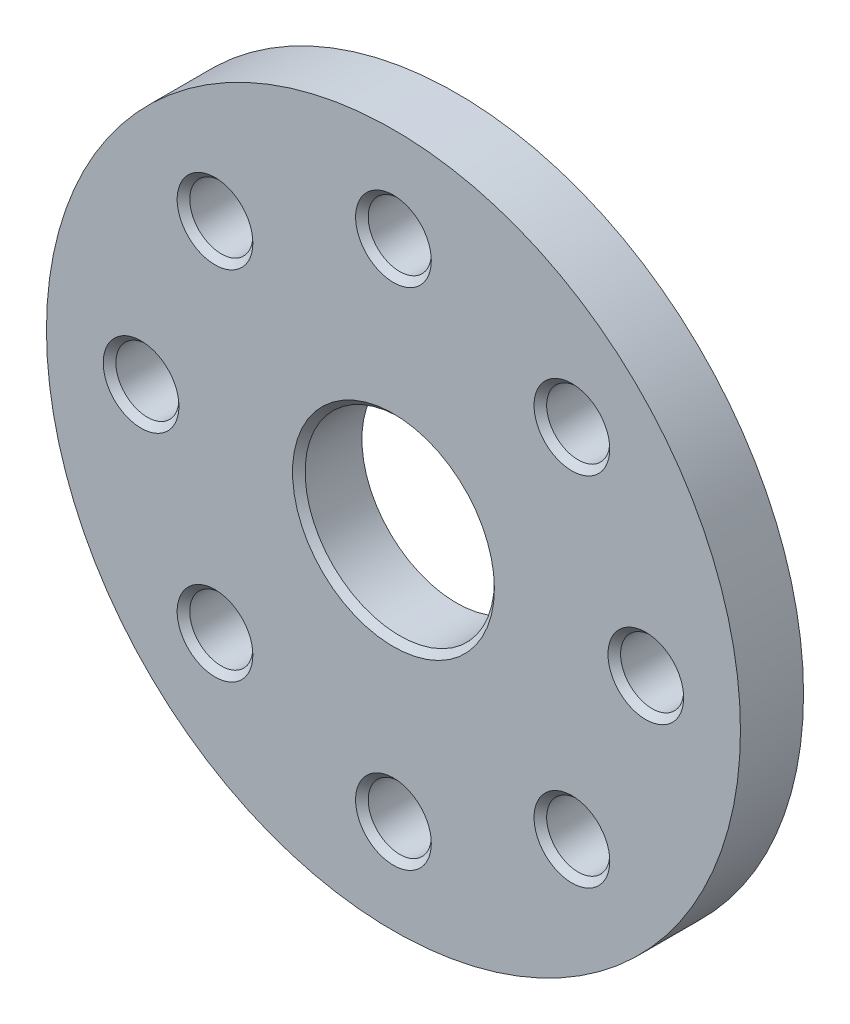
ISO-10303-21;
HEADER;
FILE_DESCRIPTION(('STEP AP214'),'2;1');
FILE_NAME('part.step','',(''),(''),'','','');
FILE_SCHEMA(('AUTOMOTIVE_DESIGN { 1 0 10303 214 1 1 1 1 }'));
ENDSEC;
DATA;
#1=APPLICATION_CONTEXT('core data for automotive mechanical design processes');
#2=APPLICATION_PROTOCOL_DEFINITION('international standard','automotive_design',2000,#1);
#3=PRODUCT_CONTEXT('',#1,'mechanical');
#4=PRODUCT('Part','Part','',(#3));
#5=PRODUCT_RELATED_PRODUCT_CATEGORY('part','',(#4));
#6=PRODUCT_DEFINITION_FORMATION('','',#4);
#7=PRODUCT_DEFINITION_CONTEXT('part definition',#1,'design');
#8=PRODUCT_DEFINITION('design','',#6,#7);
#9=PRODUCT_DEFINITION_SHAPE('','',#8);
#10=(LENGTH_UNIT() NAMED_UNIT(*) SI_UNIT(.MILLI.,.METRE.));
#11=(NAMED_UNIT(*) PLANE_ANGLE_UNIT() SI_UNIT($,.RADIAN.));
#12=(NAMED_UNIT(*) SI_UNIT($,.STERADIAN.) SOLID_ANGLE_UNIT());
#13=UNCERTAINTY_MEASURE_WITH_UNIT(LENGTH_MEASURE(1.E-05),#10,'distance_accuracy_value','');
#14=(GEOMETRIC_REPRESENTATION_CONTEXT(3) GLOBAL_UNCERTAINTY_ASSIGNED_CONTEXT((#13)) GLOBAL_UNIT_ASSIGNED_CONTEXT((#10,
#11,#12)) REPRESENTATION_CONTEXT('',''));
#15=CARTESIAN_POINT('',(0.,0.,0.));
#16=DIRECTION('',(0.,0.,1.));
#17=DIRECTION('',(1.,0.,0.));
#18=AXIS2_PLACEMENT_3D('',#15,#16,#17);
#19=CARTESIAN_POINT('',(0.,0.,2.));
#20=DIRECTION('',(0.,0.,-1.));
#21=DIRECTION('',(-1.,0.,0.));
#22=AXIS2_PLACEMENT_3D('',#19,#20,#21);
#23=CYLINDRICAL_SURFACE('',#22,11.);
#24=CARTESIAN_POINT('',(0.,0.,2.));
#25=DIRECTION('',(0.,0.,1.));
#26=DIRECTION('',(1.,0.,0.));
#27=AXIS2_PLACEMENT_3D('',#24,#25,#26);
#28=CIRCLE('',#27,11.);
#29=CARTESIAN_POINT('',(11.,0.,2.));
#30=VERTEX_POINT('',#29);
#31=EDGE_CURVE('E95',#30,#30,#28,.T.);
#32=ORIENTED_EDGE('',*,*,#31,.F.);
#33=EDGE_LOOP('',(#32));
#34=FACE_BOUND('',#33,.T.);
#35=CARTESIAN_POINT('',(0.,0.,0.));
#36=DIRECTION('',(0.,0.,1.));
#37=DIRECTION('',(1.,0.,0.));
#38=AXIS2_PLACEMENT_3D('',#35,#36,#37);
#39=CIRCLE('',#38,11.);
#40=CARTESIAN_POINT('',(11.,0.,0.));
#41=VERTEX_POINT('',#40);
#42=EDGE_CURVE('E96',#41,#41,#39,.T.);
#43=ORIENTED_EDGE('',*,*,#42,.T.);
#44=EDGE_LOOP('',(#43));
#45=FACE_BOUND('',#44,.T.);
#46=ADVANCED_FACE('F33',(#34,#45),#23,.T.);
#47=CARTESIAN_POINT('',(0.,0.,2.));
#48=DIRECTION('',(0.,0.,1.));
#49=DIRECTION('',(1.,0.,0.));
#50=AXIS2_PLACEMENT_3D('',#47,#48,#49);
#51=PLANE('',#50);
#52=CARTESIAN_POINT('',(-5.65685424949239,5.65685424949237,2.));
#53=DIRECTION('',(0.,0.,1.));
#54=DIRECTION('',(1.,0.,0.));
#55=AXIS2_PLACEMENT_3D('',#52,#53,#54);
#56=CIRCLE('',#55,1.2);
#57=CARTESIAN_POINT('',(-4.45685424949239,5.65685424949237,2.));
#58=VERTEX_POINT('',#57);
#59=EDGE_CURVE('E48',#58,#58,#56,.F.);
#60=ORIENTED_EDGE('',*,*,#59,.T.);
#61=EDGE_LOOP('',(#60));
#62=FACE_BOUND('',#61,.T.);
#63=CARTESIAN_POINT('',(-8.,0.,2.));
#64=DIRECTION('',(0.,0.,1.));
#65=DIRECTION('',(1.,0.,0.));
#66=AXIS2_PLACEMENT_3D('',#63,#64,#65);
#67=CIRCLE('',#66,1.2);
#68=CARTESIAN_POINT('',(-6.8,0.,2.));
#69=VERTEX_POINT('',#68);
#70=EDGE_CURVE('E53',#69,#69,#67,.F.);
#71=ORIENTED_EDGE('',*,*,#70,.T.);
#72=EDGE_LOOP('',(#71));
#73=FACE_BOUND('',#72,.T.);
#74=CARTESIAN_POINT('',(0.,-8.,2.));
#75=DIRECTION('',(0.,0.,1.));
#76=DIRECTION('',(1.,0.,0.));
#77=AXIS2_PLACEMENT_3D('',#74,#75,#76);
#78=CIRCLE('',#77,1.2);
#79=CARTESIAN_POINT('',(1.2,-8.,2.));
#80=VERTEX_POINT('',#79);
#81=EDGE_CURVE('E56',#80,#80,#78,.F.);
#82=ORIENTED_EDGE('',*,*,#81,.T.);
#83=EDGE_LOOP('',(#82));
#84=FACE_BOUND('',#83,.T.);
#85=CARTESIAN_POINT('',(5.65685424949243,-5.65685424949233,2.));
#86=DIRECTION('',(0.,0.,1.));
#87=DIRECTION('',(1.,0.,0.));
#88=AXIS2_PLACEMENT_3D('',#85,#86,#87);
#89=CIRCLE('',#88,1.20000000000001);
#90=CARTESIAN_POINT('',(6.85685424949244,-5.65685424949233,2.));
#91=VERTEX_POINT('',#90);
#92=EDGE_CURVE('E59',#91,#91,#89,.F.);
#93=ORIENTED_EDGE('',*,*,#92,.T.);
#94=EDGE_LOOP('',(#93));
#95=FACE_BOUND('',#94,.T.);
#96=CARTESIAN_POINT('',(8.,0.,2.));
#97=DIRECTION('',(0.,0.,1.));
#98=DIRECTION('',(1.,0.,0.));
#99=AXIS2_PLACEMENT_3D('',#96,#97,#98);
#100=CIRCLE('',#99,1.2);
#101=CARTESIAN_POINT('',(9.2,0.,2.));
#102=VERTEX_POINT('',#101);
#103=EDGE_CURVE('E68',#102,#102,#100,.F.);
#104=ORIENTED_EDGE('',*,*,#103,.T.);
#105=EDGE_LOOP('',(#104));
#106=FACE_BOUND('',#105,.T.);
#107=CARTESIAN_POINT('',(5.65685424949231,5.65685424949245,2.));
#108=DIRECTION('',(0.,0.,1.));
#109=DIRECTION('',(1.,0.,0.));
#110=AXIS2_PLACEMENT_3D('',#107,#108,#109);
#111=CIRCLE('',#110,1.2);
#112=CARTESIAN_POINT('',(6.85685424949232,5.65685424949245,2.));
#113=VERTEX_POINT('',#112);
#114=EDGE_CURVE('E71',#113,#113,#111,.F.);
#115=ORIENTED_EDGE('',*,*,#114,.T.);
#116=EDGE_LOOP('',(#115));
#117=FACE_BOUND('',#116,.T.);
#118=CARTESIAN_POINT('',(-5.65685424949235,-5.65685424949241,2.));
#119=DIRECTION('',(0.,0.,1.));
#120=DIRECTION('',(1.,0.,0.));
#121=AXIS2_PLACEMENT_3D('',#118,#119,#120);
#122=CIRCLE('',#121,1.20000000000001);
#123=CARTESIAN_POINT('',(-4.45685424949234,-5.65685424949241,2.));
#124=VERTEX_POINT('',#123);
#125=EDGE_CURVE('E77',#124,#124,#122,.F.);
#126=ORIENTED_EDGE('',*,*,#125,.T.);
#127=EDGE_LOOP('',(#126));
#128=FACE_BOUND('',#127,.T.);
#129=CARTESIAN_POINT('',(0.,0.,2.));
#130=DIRECTION('',(0.,0.,1.));
#131=DIRECTION('',(1.,0.,0.));
#132=AXIS2_PLACEMENT_3D('',#129,#130,#131);
#133=CIRCLE('',#132,3.19999999999999);
#134=CARTESIAN_POINT('',(3.19999999999999,0.,2.));
#135=VERTEX_POINT('',#134);
#136=EDGE_CURVE('E83',#135,#135,#133,.F.);
#137=ORIENTED_EDGE('',*,*,#136,.T.);
#138=EDGE_LOOP('',(#137));
#139=FACE_BOUND('',#138,.T.);
#140=CARTESIAN_POINT('',(0.,8.,2.));
#141=DIRECTION('',(0.,0.,1.));
#142=DIRECTION('',(1.,0.,0.));
#143=AXIS2_PLACEMENT_3D('',#140,#141,#142);
#144=CIRCLE('',#143,1.2);
#145=CARTESIAN_POINT('',(1.2,8.,2.));
#146=VERTEX_POINT('',#145);
#147=EDGE_CURVE('E89',#146,#146,#144,.F.);
#148=ORIENTED_EDGE('',*,*,#147,.T.);
#149=EDGE_LOOP('',(#148));
#150=FACE_BOUND('',#149,.T.);
#151=ORIENTED_EDGE('',*,*,#31,.T.);
#152=EDGE_LOOP('',(#151));
#153=FACE_BOUND('',#152,.T.);
#154=ADVANCED_FACE('F149',(#62,#73,#84,#95,#106,#117,#128,#139,#150,#153),#51,.T.);
#155=CARTESIAN_POINT('',(0.,0.,0.));
#156=DIRECTION('',(0.,0.,1.));
#157=DIRECTION('',(1.,0.,0.));
#158=AXIS2_PLACEMENT_3D('',#155,#156,#157);
#159=PLANE('',#158);
#160=CARTESIAN_POINT('',(5.65685424949231,5.65685424949245,0.));
#161=DIRECTION('',(0.,0.,1.));
#162=DIRECTION('',(0.707106781186556,-0.707106781186539,0.));
#163=AXIS2_PLACEMENT_3D('',#160,#161,#162);
#164=CIRCLE('',#163,1.);
#165=CARTESIAN_POINT('',(6.36396103067887,4.94974746830591,0.));
#166=VERTEX_POINT('',#165);
#167=EDGE_CURVE('E125',#166,#166,#164,.T.);
#168=ORIENTED_EDGE('',*,*,#167,.T.);
#169=EDGE_LOOP('',(#168));
#170=FACE_BOUND('',#169,.T.);
#171=CARTESIAN_POINT('',(8.,0.,0.));
#172=DIRECTION('',(0.,0.,1.));
#173=DIRECTION('',(0.,-1.,0.));
#174=AXIS2_PLACEMENT_3D('',#171,#172,#173);
#175=CIRCLE('',#174,1.);
#176=CARTESIAN_POINT('',(8.00000000000001,-0.999999999999917,0.));
#177=VERTEX_POINT('',#176);
#178=EDGE_CURVE('E122',#177,#177,#175,.T.);
#179=ORIENTED_EDGE('',*,*,#178,.T.);
#180=EDGE_LOOP('',(#179));
#181=FACE_BOUND('',#180,.T.);
#182=CARTESIAN_POINT('',(5.65685424949243,-5.65685424949233,0.));
#183=DIRECTION('',(0.,0.,1.));
#184=DIRECTION('',(-0.707106781186541,-0.707106781186554,0.));
#185=AXIS2_PLACEMENT_3D('',#182,#183,#184);
#186=CIRCLE('',#185,1.);
#187=CARTESIAN_POINT('',(4.94974746830589,-6.36396103067888,0.));
#188=VERTEX_POINT('',#187);
#189=EDGE_CURVE('E119',#188,#188,#186,.T.);
#190=ORIENTED_EDGE('',*,*,#189,.T.);
#191=EDGE_LOOP('',(#190));
#192=FACE_BOUND('',#191,.T.);
#193=CARTESIAN_POINT('',(0.,-8.,0.));
#194=DIRECTION('',(0.,0.,1.));
#195=DIRECTION('',(-1.,0.,0.));
#196=AXIS2_PLACEMENT_3D('',#193,#194,#195);
#197=CIRCLE('',#196,1.);
#198=CARTESIAN_POINT('',(-1.,-8.,0.));
#199=VERTEX_POINT('',#198);
#200=EDGE_CURVE('E116',#199,#199,#197,.T.);
#201=ORIENTED_EDGE('',*,*,#200,.T.);
#202=EDGE_LOOP('',(#201));
#203=FACE_BOUND('',#202,.T.);
#204=CARTESIAN_POINT('',(-5.65685424949235,-5.65685424949241,0.));
#205=DIRECTION('',(0.,0.,1.));
#206=DIRECTION('',(-0.707106781186551,0.707106781186544,0.));
#207=AXIS2_PLACEMENT_3D('',#204,#205,#206);
#208=CIRCLE('',#207,1.);
#209=CARTESIAN_POINT('',(-6.3639610306789,-4.94974746830587,0.));
#210=VERTEX_POINT('',#209);
#211=EDGE_CURVE('E113',#210,#210,#208,.T.);
#212=ORIENTED_EDGE('',*,*,#211,.T.);
#213=EDGE_LOOP('',(#212));
#214=FACE_BOUND('',#213,.T.);
#215=CARTESIAN_POINT('',(-8.,0.,0.));
#216=DIRECTION('',(0.,0.,1.));
#217=DIRECTION('',(0.,1.,0.));
#218=AXIS2_PLACEMENT_3D('',#215,#216,#217);
#219=CIRCLE('',#218,1.);
#220=CARTESIAN_POINT('',(-8.,0.999999999999972,0.));
#221=VERTEX_POINT('',#220);
#222=EDGE_CURVE('E110',#221,#221,#219,.T.);
#223=ORIENTED_EDGE('',*,*,#222,.T.);
#224=EDGE_LOOP('',(#223));
#225=FACE_BOUND('',#224,.T.);
#226=CARTESIAN_POINT('',(-5.65685424949239,5.65685424949237,0.));
#227=DIRECTION('',(0.,0.,1.));
#228=DIRECTION('',(0.707106781186546,0.707106781186549,0.));
#229=AXIS2_PLACEMENT_3D('',#226,#227,#228);
#230=CIRCLE('',#229,1.);
#231=CARTESIAN_POINT('',(-4.94974746830584,6.36396103067892,0.));
#232=VERTEX_POINT('',#231);
#233=EDGE_CURVE('E107',#232,#232,#230,.T.);
#234=ORIENTED_EDGE('',*,*,#233,.T.);
#235=EDGE_LOOP('',(#234));
#236=FACE_BOUND('',#235,.T.);
#237=CARTESIAN_POINT('',(0.,8.,0.));
#238=DIRECTION('',(0.,0.,1.));
#239=DIRECTION('',(1.,0.,0.));
#240=AXIS2_PLACEMENT_3D('',#237,#238,#239);
#241=CIRCLE('',#240,1.);
#242=CARTESIAN_POINT('',(1.,8.,0.));
#243=VERTEX_POINT('',#242);
#244=EDGE_CURVE('E104',#243,#243,#241,.T.);
#245=ORIENTED_EDGE('',*,*,#244,.T.);
#246=EDGE_LOOP('',(#245));
#247=FACE_BOUND('',#246,.T.);
#248=CARTESIAN_POINT('',(0.,0.,0.));
#249=DIRECTION('',(0.,0.,1.));
#250=DIRECTION('',(1.,0.,0.));
#251=AXIS2_PLACEMENT_3D('',#248,#249,#250);
#252=CIRCLE('',#251,3.);
#253=CARTESIAN_POINT('',(3.,0.,0.));
#254=VERTEX_POINT('',#253);
#255=EDGE_CURVE('E99',#254,#254,#252,.T.);
#256=ORIENTED_EDGE('',*,*,#255,.T.);
#257=EDGE_LOOP('',(#256));
#258=FACE_BOUND('',#257,.T.);
#259=ORIENTED_EDGE('',*,*,#42,.F.);
#260=EDGE_LOOP('',(#259));
#261=FACE_BOUND('',#260,.T.);
#262=ADVANCED_FACE('F129',(#170,#181,#192,#203,#214,#225,#236,#247,#258,#261),#159,.F.);
#263=CARTESIAN_POINT('',(0.,0.,0.));
#264=DIRECTION('',(0.,0.,1.));
#265=DIRECTION('',(1.,0.,0.));
#266=AXIS2_PLACEMENT_3D('',#263,#264,#265);
#267=CYLINDRICAL_SURFACE('',#266,3.);
#268=CARTESIAN_POINT('',(0.,0.,1.80000000000001));
#269=DIRECTION('',(0.,0.,1.));
#270=DIRECTION('',(1.,0.,0.));
#271=AXIS2_PLACEMENT_3D('',#268,#269,#270);
#272=CIRCLE('',#271,3.);
#273=CARTESIAN_POINT('',(3.,0.,1.80000000000001));
#274=VERTEX_POINT('',#273);
#275=EDGE_CURVE('E86',#274,#274,#272,.T.);
#276=ORIENTED_EDGE('',*,*,#275,.T.);
#277=EDGE_LOOP('',(#276));
#278=FACE_BOUND('',#277,.T.);
#279=ORIENTED_EDGE('',*,*,#255,.F.);
#280=EDGE_LOOP('',(#279));
#281=FACE_BOUND('',#280,.T.);
#282=ADVANCED_FACE('F213',(#278,#281),#267,.F.);
#283=CARTESIAN_POINT('',(0.,8.,0.));
#284=DIRECTION('',(0.,0.,1.));
#285=DIRECTION('',(1.,0.,0.));
#286=AXIS2_PLACEMENT_3D('',#283,#284,#285);
#287=CYLINDRICAL_SURFACE('',#286,1.);
#288=CARTESIAN_POINT('',(0.,8.,1.8));
#289=DIRECTION('',(0.,0.,1.));
#290=DIRECTION('',(1.,0.,0.));
#291=AXIS2_PLACEMENT_3D('',#288,#289,#290);
#292=CIRCLE('',#291,1.);
#293=CARTESIAN_POINT('',(1.,8.,1.8));
#294=VERTEX_POINT('',#293);
#295=EDGE_CURVE('E92',#294,#294,#292,.T.);
#296=ORIENTED_EDGE('',*,*,#295,.T.);
#297=EDGE_LOOP('',(#296));
#298=FACE_BOUND('',#297,.T.);
#299=ORIENTED_EDGE('',*,*,#244,.F.);
#300=EDGE_LOOP('',(#299));
#301=FACE_BOUND('',#300,.T.);
#302=ADVANCED_FACE('F165',(#298,#301),#287,.F.);
#303=CARTESIAN_POINT('',(0.,8.,1.8));
#304=DIRECTION('',(0.,0.,1.));
#305=DIRECTION('',(1.,0.,0.));
#306=AXIS2_PLACEMENT_3D('',#303,#304,#305);
#307=CONICAL_SURFACE('',#306,1.,0.785398163397453);
#308=ORIENTED_EDGE('',*,*,#147,.F.);
#309=EDGE_LOOP('',(#308));
#310=FACE_BOUND('',#309,.T.);
#311=ORIENTED_EDGE('',*,*,#295,.F.);
#312=EDGE_LOOP('',(#311));
#313=FACE_BOUND('',#312,.T.);
#314=ADVANCED_FACE('F161',(#310,#313),#307,.F.);
#315=CARTESIAN_POINT('',(0.,0.,1.80000000000001));
#316=DIRECTION('',(0.,0.,1.));
#317=DIRECTION('',(1.,0.,0.));
#318=AXIS2_PLACEMENT_3D('',#315,#316,#317);
#319=CONICAL_SURFACE('',#318,3.,0.78539816339745);
#320=ORIENTED_EDGE('',*,*,#136,.F.);
#321=EDGE_LOOP('',(#320));
#322=FACE_BOUND('',#321,.T.);
#323=ORIENTED_EDGE('',*,*,#275,.F.);
#324=EDGE_LOOP('',(#323));
#325=FACE_BOUND('',#324,.T.);
#326=ADVANCED_FACE('F164',(#322,#325),#319,.F.);
#327=CARTESIAN_POINT('',(-5.65685424949239,5.65685424949237,0.));
#328=DIRECTION('',(0.,0.,1.));
#329=DIRECTION('',(1.,0.,0.));
#330=AXIS2_PLACEMENT_3D('',#327,#328,#329);
#331=CYLINDRICAL_SURFACE('',#330,1.);
#332=CARTESIAN_POINT('',(-5.65685424949239,5.65685424949237,1.80000000000001));
#333=DIRECTION('',(0.,0.,1.));
#334=DIRECTION('',(1.,0.,0.));
#335=AXIS2_PLACEMENT_3D('',#332,#333,#334);
#336=CIRCLE('',#335,1.);
#337=CARTESIAN_POINT('',(-4.65685424949239,5.65685424949237,1.80000000000001));
#338=VERTEX_POINT('',#337);
#339=EDGE_CURVE('E62',#338,#338,#336,.T.);
#340=ORIENTED_EDGE('',*,*,#339,.T.);
#341=EDGE_LOOP('',(#340));
#342=FACE_BOUND('',#341,.T.);
#343=ORIENTED_EDGE('',*,*,#233,.F.);
#344=EDGE_LOOP('',(#343));
#345=FACE_BOUND('',#344,.T.);
#346=ADVANCED_FACE('F168',(#342,#345),#331,.F.);
#347=CARTESIAN_POINT('',(-8.,0.,0.));
#348=DIRECTION('',(0.,0.,1.));
#349=DIRECTION('',(1.,0.,0.));
#350=AXIS2_PLACEMENT_3D('',#347,#348,#349);
#351=CYLINDRICAL_SURFACE('',#350,1.);
#352=CARTESIAN_POINT('',(-8.,0.,1.8));
#353=DIRECTION('',(0.,0.,1.));
#354=DIRECTION('',(1.,0.,0.));
#355=AXIS2_PLACEMENT_3D('',#352,#353,#354);
#356=CIRCLE('',#355,1.);
#357=CARTESIAN_POINT('',(-7.,0.,1.8));
#358=VERTEX_POINT('',#357);
#359=EDGE_CURVE('E44',#358,#358,#356,.T.);
#360=ORIENTED_EDGE('',*,*,#359,.T.);
#361=EDGE_LOOP('',(#360));
#362=FACE_BOUND('',#361,.T.);
#363=ORIENTED_EDGE('',*,*,#222,.F.);
#364=EDGE_LOOP('',(#363));
#365=FACE_BOUND('',#364,.T.);
#366=ADVANCED_FACE('F231',(#362,#365),#351,.F.);
#367=CARTESIAN_POINT('',(-5.65685424949235,-5.65685424949241,0.));
#368=DIRECTION('',(0.,0.,1.));
#369=DIRECTION('',(1.,0.,0.));
#370=AXIS2_PLACEMENT_3D('',#367,#368,#369);
#371=CYLINDRICAL_SURFACE('',#370,1.);
#372=CARTESIAN_POINT('',(-5.65685424949235,-5.65685424949241,1.8));
#373=DIRECTION('',(0.,0.,1.));
#374=DIRECTION('',(1.,0.,0.));
#375=AXIS2_PLACEMENT_3D('',#372,#373,#374);
#376=CIRCLE('',#375,1.);
#377=CARTESIAN_POINT('',(-4.65685424949235,-5.65685424949241,1.8));
#378=VERTEX_POINT('',#377);
#379=EDGE_CURVE('E80',#378,#378,#376,.T.);
#380=ORIENTED_EDGE('',*,*,#379,.T.);
#381=EDGE_LOOP('',(#380));
#382=FACE_BOUND('',#381,.T.);
#383=ORIENTED_EDGE('',*,*,#211,.F.);
#384=EDGE_LOOP('',(#383));
#385=FACE_BOUND('',#384,.T.);
#386=ADVANCED_FACE('F235',(#382,#385),#371,.F.);
#387=CARTESIAN_POINT('',(0.,-8.,0.));
#388=DIRECTION('',(0.,0.,1.));
#389=DIRECTION('',(1.,0.,0.));
#390=AXIS2_PLACEMENT_3D('',#387,#388,#389);
#391=CYLINDRICAL_SURFACE('',#390,1.);
#392=CARTESIAN_POINT('',(0.,-8.,1.8));
#393=DIRECTION('',(0.,0.,1.));
#394=DIRECTION('',(1.,0.,0.));
#395=AXIS2_PLACEMENT_3D('',#392,#393,#394);
#396=CIRCLE('',#395,1.);
#397=CARTESIAN_POINT('',(1.,-8.,1.8));
#398=VERTEX_POINT('',#397);
#399=EDGE_CURVE('E40',#398,#398,#396,.T.);
#400=ORIENTED_EDGE('',*,*,#399,.T.);
#401=EDGE_LOOP('',(#400));
#402=FACE_BOUND('',#401,.T.);
#403=ORIENTED_EDGE('',*,*,#200,.F.);
#404=EDGE_LOOP('',(#403));
#405=FACE_BOUND('',#404,.T.);
#406=ADVANCED_FACE('F239',(#402,#405),#391,.F.);
#407=CARTESIAN_POINT('',(5.65685424949243,-5.65685424949233,0.));
#408=DIRECTION('',(0.,0.,1.));
#409=DIRECTION('',(1.,0.,0.));
#410=AXIS2_PLACEMENT_3D('',#407,#408,#409);
#411=CYLINDRICAL_SURFACE('',#410,1.);
#412=CARTESIAN_POINT('',(5.65685424949243,-5.65685424949233,1.8));
#413=DIRECTION('',(0.,0.,1.));
#414=DIRECTION('',(1.,0.,0.));
#415=AXIS2_PLACEMENT_3D('',#412,#413,#414);
#416=CIRCLE('',#415,1.);
#417=CARTESIAN_POINT('',(6.65685424949243,-5.65685424949233,1.8));
#418=VERTEX_POINT('',#417);
#419=EDGE_CURVE('E10',#418,#418,#416,.T.);
#420=ORIENTED_EDGE('',*,*,#419,.T.);
#421=EDGE_LOOP('',(#420));
#422=FACE_BOUND('',#421,.T.);
#423=ORIENTED_EDGE('',*,*,#189,.F.);
#424=EDGE_LOOP('',(#423));
#425=FACE_BOUND('',#424,.T.);
#426=ADVANCED_FACE('F145',(#422,#425),#411,.F.);
#427=CARTESIAN_POINT('',(8.,0.,0.));
#428=DIRECTION('',(0.,0.,1.));
#429=DIRECTION('',(1.,0.,0.));
#430=AXIS2_PLACEMENT_3D('',#427,#428,#429);
#431=CYLINDRICAL_SURFACE('',#430,1.);
#432=CARTESIAN_POINT('',(8.,0.,1.8));
#433=DIRECTION('',(0.,0.,1.));
#434=DIRECTION('',(1.,0.,0.));
#435=AXIS2_PLACEMENT_3D('',#432,#433,#434);
#436=CIRCLE('',#435,1.);
#437=CARTESIAN_POINT('',(9.,0.,1.8));
#438=VERTEX_POINT('',#437);
#439=EDGE_CURVE('E74',#438,#438,#436,.T.);
#440=ORIENTED_EDGE('',*,*,#439,.T.);
#441=EDGE_LOOP('',(#440));
#442=FACE_BOUND('',#441,.T.);
#443=ORIENTED_EDGE('',*,*,#178,.F.);
#444=EDGE_LOOP('',(#443));
#445=FACE_BOUND('',#444,.T.);
#446=ADVANCED_FACE('F135',(#442,#445),#431,.F.);
#447=CARTESIAN_POINT('',(5.65685424949231,5.65685424949245,0.));
#448=DIRECTION('',(0.,0.,1.));
#449=DIRECTION('',(1.,0.,0.));
#450=AXIS2_PLACEMENT_3D('',#447,#448,#449);
#451=CYLINDRICAL_SURFACE('',#450,1.);
#452=CARTESIAN_POINT('',(5.65685424949231,5.65685424949245,1.8));
#453=DIRECTION('',(0.,0.,1.));
#454=DIRECTION('',(1.,0.,0.));
#455=AXIS2_PLACEMENT_3D('',#452,#453,#454);
#456=CIRCLE('',#455,1.);
#457=CARTESIAN_POINT('',(6.65685424949231,5.65685424949245,1.8));
#458=VERTEX_POINT('',#457);
#459=EDGE_CURVE('E65',#458,#458,#456,.T.);
#460=ORIENTED_EDGE('',*,*,#459,.T.);
#461=EDGE_LOOP('',(#460));
#462=FACE_BOUND('',#461,.T.);
#463=ORIENTED_EDGE('',*,*,#167,.F.);
#464=EDGE_LOOP('',(#463));
#465=FACE_BOUND('',#464,.T.);
#466=ADVANCED_FACE('F132',(#462,#465),#451,.F.);
#467=CARTESIAN_POINT('',(-5.65685424949235,-5.65685424949241,1.8));
#468=DIRECTION('',(0.,0.,1.));
#469=DIRECTION('',(1.,0.,0.));
#470=AXIS2_PLACEMENT_3D('',#467,#468,#469);
#471=CONICAL_SURFACE('',#470,1.,0.785398163397456);
#472=CARTESIAN_POINT('',(-4.45685424949234,-5.65685424949241,2.));
#473=CARTESIAN_POINT('',(-4.45893758282568,-5.65685424949241,1.99791666666667));
#474=CARTESIAN_POINT('',(-4.46102091615901,-5.65685424949241,1.99583333333333));
#475=CARTESIAN_POINT('',(-4.46518758282568,-5.65685424949241,1.99166666666667));
#476=CARTESIAN_POINT('',(-4.46727091615901,-5.65685424949241,1.98958333333333));
#477=CARTESIAN_POINT('',(-4.47143758282568,-5.65685424949241,1.98541666666667));
#478=CARTESIAN_POINT('',(-4.47352091615901,-5.65685424949241,1.98333333333333));
#479=CARTESIAN_POINT('',(-4.47768758282568,-5.65685424949241,1.97916666666667));
#480=CARTESIAN_POINT('',(-4.47977091615901,-5.65685424949241,1.97708333333333));
#481=CARTESIAN_POINT('',(-4.48393758282568,-5.65685424949241,1.97291666666667));
#482=CARTESIAN_POINT('',(-4.48602091615901,-5.65685424949241,1.97083333333333));
#483=CARTESIAN_POINT('',(-4.49018758282568,-5.65685424949241,1.96666666666667));
#484=CARTESIAN_POINT('',(-4.49227091615901,-5.65685424949241,1.96458333333333));
#485=CARTESIAN_POINT('',(-4.49643758282568,-5.65685424949241,1.96041666666667));
#486=CARTESIAN_POINT('',(-4.49852091615901,-5.65685424949241,1.95833333333333));
#487=CARTESIAN_POINT('',(-4.50268758282568,-5.65685424949241,1.95416666666667));
#488=CARTESIAN_POINT('',(-4.50477091615901,-5.65685424949241,1.95208333333333));
#489=CARTESIAN_POINT('',(-4.50893758282568,-5.65685424949241,1.94791666666667));
#490=CARTESIAN_POINT('',(-4.51102091615901,-5.65685424949241,1.94583333333333));
#491=CARTESIAN_POINT('',(-4.51518758282568,-5.65685424949241,1.94166666666667));
#492=CARTESIAN_POINT('',(-4.51727091615901,-5.65685424949241,1.93958333333333));
#493=CARTESIAN_POINT('',(-4.52143758282568,-5.65685424949241,1.93541666666667));
#494=CARTESIAN_POINT('',(-4.52352091615901,-5.65685424949241,1.93333333333333));
#495=CARTESIAN_POINT('',(-4.52768758282568,-5.65685424949241,1.92916666666666));
#496=CARTESIAN_POINT('',(-4.52977091615901,-5.65685424949241,1.92708333333333));
#497=CARTESIAN_POINT('',(-4.53393758282568,-5.65685424949241,1.92291666666666));
#498=CARTESIAN_POINT('',(-4.53602091615901,-5.65685424949241,1.92083333333333));
#499=CARTESIAN_POINT('',(-4.54018758282568,-5.65685424949241,1.91666666666666));
#500=CARTESIAN_POINT('',(-4.54227091615901,-5.65685424949241,1.91458333333333));
#501=CARTESIAN_POINT('',(-4.54643758282568,-5.65685424949241,1.91041666666666));
#502=CARTESIAN_POINT('',(-4.54852091615901,-5.65685424949241,1.90833333333333));
#503=CARTESIAN_POINT('',(-4.55268758282568,-5.65685424949241,1.90416666666666));
#504=CARTESIAN_POINT('',(-4.55477091615901,-5.65685424949241,1.90208333333333));
#505=CARTESIAN_POINT('',(-4.55893758282568,-5.65685424949241,1.89791666666666));
#506=CARTESIAN_POINT('',(-4.56102091615901,-5.65685424949241,1.89583333333333));
#507=CARTESIAN_POINT('',(-4.56518758282568,-5.65685424949241,1.89166666666666));
#508=CARTESIAN_POINT('',(-4.56727091615901,-5.65685424949241,1.88958333333333));
#509=CARTESIAN_POINT('',(-4.57143758282568,-5.65685424949241,1.88541666666666));
#510=CARTESIAN_POINT('',(-4.57352091615901,-5.65685424949241,1.88333333333333));
#511=CARTESIAN_POINT('',(-4.57768758282568,-5.65685424949241,1.87916666666666));
#512=CARTESIAN_POINT('',(-4.57977091615901,-5.65685424949241,1.87708333333333));
#513=CARTESIAN_POINT('',(-4.58393758282568,-5.65685424949241,1.87291666666666));
#514=CARTESIAN_POINT('',(-4.58602091615901,-5.65685424949241,1.87083333333333));
#515=CARTESIAN_POINT('',(-4.59018758282568,-5.65685424949241,1.86666666666666));
#516=CARTESIAN_POINT('',(-4.59227091615901,-5.65685424949241,1.86458333333333));
#517=CARTESIAN_POINT('',(-4.59643758282568,-5.65685424949241,1.86041666666666));
#518=CARTESIAN_POINT('',(-4.59852091615902,-5.65685424949241,1.85833333333333));
#519=CARTESIAN_POINT('',(-4.60268758282568,-5.65685424949241,1.85416666666666));
#520=CARTESIAN_POINT('',(-4.60477091615902,-5.65685424949241,1.85208333333333));
#521=CARTESIAN_POINT('',(-4.60893758282568,-5.65685424949241,1.84791666666666));
#522=CARTESIAN_POINT('',(-4.61102091615902,-5.65685424949241,1.84583333333333));
#523=CARTESIAN_POINT('',(-4.61518758282568,-5.65685424949241,1.84166666666666));
#524=CARTESIAN_POINT('',(-4.61727091615902,-5.65685424949241,1.83958333333333));
#525=CARTESIAN_POINT('',(-4.62143758282568,-5.65685424949241,1.83541666666666));
#526=CARTESIAN_POINT('',(-4.62352091615902,-5.65685424949241,1.83333333333333));
#527=CARTESIAN_POINT('',(-4.62768758282568,-5.65685424949241,1.82916666666666));
#528=CARTESIAN_POINT('',(-4.62977091615902,-5.65685424949241,1.82708333333333));
#529=CARTESIAN_POINT('',(-4.63393758282568,-5.65685424949241,1.82291666666666));
#530=CARTESIAN_POINT('',(-4.63602091615902,-5.65685424949241,1.82083333333333));
#531=CARTESIAN_POINT('',(-4.64018758282568,-5.65685424949241,1.81666666666666));
#532=CARTESIAN_POINT('',(-4.64227091615902,-5.65685424949241,1.81458333333333));
#533=CARTESIAN_POINT('',(-4.64643758282568,-5.65685424949241,1.81041666666666));
#534=CARTESIAN_POINT('',(-4.64852091615902,-5.65685424949241,1.80833333333333));
#535=CARTESIAN_POINT('',(-4.65268758282568,-5.65685424949241,1.80416666666666));
#536=CARTESIAN_POINT('',(-4.65477091615902,-5.65685424949241,1.80208333333333));
#537=CARTESIAN_POINT('',(-4.65685424949235,-5.65685424949241,1.8));
#538=B_SPLINE_CURVE_WITH_KNOTS('',3,(#472,#473,#474,#475,#476,#477,#478,#479,#480,#481,#482,
#483,#484,#485,#486,#487,#488,#489,#490,#491,#492,#493,#494,#495,#496,#497,#498,#499,#500,#501,
#502,#503,#504,#505,#506,#507,#508,#509,#510,#511,#512,#513,#514,#515,#516,#517,#518,#519,#520,
#521,#522,#523,#524,#525,#526,#527,#528,#529,#530,#531,#532,#533,#534,#535,#536,#537),
.UNSPECIFIED.,.F.,.F.,(4,2,2,2,2,2,2,2,2,2,2,2,2,2,2,2,2,2,2,2,2,2,2,2,2,2,2,2,2,2,2,2,4),(0.,
0.00883883476483179,0.0176776695296639,0.026516504294496,0.0353553390593281,0.0441941738241602,
0.0530330085889923,0.0618718433538244,0.0707106781186565,0.0795495128834886,0.0883883476483205,
0.0972271824131532,0.106066017177985,0.114904851942817,0.12374368670765,0.132582521472481,
0.141421356237314,0.150260191002146,0.159099025766978,0.16793786053181,0.176776695296642,
0.185615530061474,0.194454364826306,0.203293199591138,0.21213203435597,0.220970869120802,
0.229809703885635,0.238648538650466,0.247487373415299,0.256326208180131,0.265165042944963,
0.274003877709795,0.282842712474627),.UNSPECIFIED.);
#539=EDGE_CURVE('BSEAM134',#124,#378,#538,.T.);
#540=ORIENTED_EDGE('',*,*,#125,.F.);
#541=ORIENTED_EDGE('',*,*,#379,.F.);
#542=ORIENTED_EDGE('',*,*,#539,.T.);
#543=ORIENTED_EDGE('',*,*,#539,.F.);
#544=EDGE_LOOP('',(#540,#542,#541,#543));
#545=FACE_BOUND('',#544,.T.);
#546=ADVANCED_FACE('F134',(#545),#471,.F.);
#547=CARTESIAN_POINT('',(8.,0.,1.8));
#548=DIRECTION('',(0.,0.,1.));
#549=DIRECTION('',(1.,0.,0.));
#550=AXIS2_PLACEMENT_3D('',#547,#548,#549);
#551=CONICAL_SURFACE('',#550,1.,0.785398163397453);
#552=ORIENTED_EDGE('',*,*,#103,.F.);
#553=EDGE_LOOP('',(#552));
#554=FACE_BOUND('',#553,.T.);
#555=ORIENTED_EDGE('',*,*,#439,.F.);
#556=EDGE_LOOP('',(#555));
#557=FACE_BOUND('',#556,.T.);
#558=ADVANCED_FACE('F142',(#554,#557),#551,.F.);
#559=CARTESIAN_POINT('',(5.65685424949231,5.65685424949245,1.8));
#560=DIRECTION('',(0.,0.,1.));
#561=DIRECTION('',(1.,0.,0.));
#562=AXIS2_PLACEMENT_3D('',#559,#560,#561);
#563=CONICAL_SURFACE('',#562,1.,0.785398163397455);
#564=ORIENTED_EDGE('',*,*,#114,.F.);
#565=EDGE_LOOP('',(#564));
#566=FACE_BOUND('',#565,.T.);
#567=ORIENTED_EDGE('',*,*,#459,.F.);
#568=EDGE_LOOP('',(#567));
#569=FACE_BOUND('',#568,.T.);
#570=ADVANCED_FACE('F173',(#566,#569),#563,.F.);
#571=CARTESIAN_POINT('',(-5.65685424949239,5.65685424949237,1.80000000000001));
#572=DIRECTION('',(0.,0.,1.));
#573=DIRECTION('',(1.,0.,0.));
#574=AXIS2_PLACEMENT_3D('',#571,#572,#573);
#575=CONICAL_SURFACE('',#574,1.,0.78539816339746);
#576=CARTESIAN_POINT('',(-4.45685424949239,5.65685424949237,2.));
#577=CARTESIAN_POINT('',(-4.45893758282573,5.65685424949237,1.99791666666667));
#578=CARTESIAN_POINT('',(-4.46102091615906,5.65685424949237,1.99583333333333));
#579=CARTESIAN_POINT('',(-4.46518758282572,5.65685424949237,1.99166666666667));
#580=CARTESIAN_POINT('',(-4.46727091615906,5.65685424949237,1.98958333333333));
#581=CARTESIAN_POINT('',(-4.47143758282572,5.65685424949237,1.98541666666667));
#582=CARTESIAN_POINT('',(-4.47352091615906,5.65685424949237,1.98333333333333));
#583=CARTESIAN_POINT('',(-4.47768758282572,5.65685424949237,1.97916666666667));
#584=CARTESIAN_POINT('',(-4.47977091615906,5.65685424949237,1.97708333333333));
#585=CARTESIAN_POINT('',(-4.48393758282572,5.65685424949237,1.97291666666667));
#586=CARTESIAN_POINT('',(-4.48602091615906,5.65685424949237,1.97083333333333));
#587=CARTESIAN_POINT('',(-4.49018758282573,5.65685424949237,1.96666666666667));
#588=CARTESIAN_POINT('',(-4.49227091615906,5.65685424949237,1.96458333333333));
#589=CARTESIAN_POINT('',(-4.49643758282572,5.65685424949237,1.96041666666667));
#590=CARTESIAN_POINT('',(-4.49852091615906,5.65685424949237,1.95833333333333));
#591=CARTESIAN_POINT('',(-4.50268758282572,5.65685424949237,1.95416666666667));
#592=CARTESIAN_POINT('',(-4.50477091615906,5.65685424949237,1.95208333333333));
#593=CARTESIAN_POINT('',(-4.50893758282572,5.65685424949237,1.94791666666667));
#594=CARTESIAN_POINT('',(-4.51102091615906,5.65685424949237,1.94583333333333));
#595=CARTESIAN_POINT('',(-4.51518758282572,5.65685424949237,1.94166666666667));
#596=CARTESIAN_POINT('',(-4.51727091615906,5.65685424949237,1.93958333333333));
#597=CARTESIAN_POINT('',(-4.52143758282572,5.65685424949237,1.93541666666667));
#598=CARTESIAN_POINT('',(-4.52352091615906,5.65685424949237,1.93333333333334));
#599=CARTESIAN_POINT('',(-4.52768758282572,5.65685424949237,1.92916666666667));
#600=CARTESIAN_POINT('',(-4.52977091615906,5.65685424949237,1.92708333333334));
#601=CARTESIAN_POINT('',(-4.53393758282572,5.65685424949237,1.92291666666667));
#602=CARTESIAN_POINT('',(-4.53602091615906,5.65685424949237,1.92083333333334));
#603=CARTESIAN_POINT('',(-4.54018758282572,5.65685424949237,1.91666666666667));
#604=CARTESIAN_POINT('',(-4.54227091615906,5.65685424949237,1.91458333333334));
#605=CARTESIAN_POINT('',(-4.54643758282572,5.65685424949237,1.91041666666667));
#606=CARTESIAN_POINT('',(-4.54852091615906,5.65685424949237,1.90833333333334));
#607=CARTESIAN_POINT('',(-4.55268758282572,5.65685424949237,1.90416666666667));
#608=CARTESIAN_POINT('',(-4.55477091615906,5.65685424949237,1.90208333333334));
#609=CARTESIAN_POINT('',(-4.55893758282572,5.65685424949237,1.89791666666667));
#610=CARTESIAN_POINT('',(-4.56102091615906,5.65685424949237,1.89583333333334));
#611=CARTESIAN_POINT('',(-4.56518758282572,5.65685424949237,1.89166666666667));
#612=CARTESIAN_POINT('',(-4.56727091615906,5.65685424949237,1.88958333333334));
#613=CARTESIAN_POINT('',(-4.57143758282572,5.65685424949237,1.88541666666667));
#614=CARTESIAN_POINT('',(-4.57352091615906,5.65685424949237,1.88333333333334));
#615=CARTESIAN_POINT('',(-4.57768758282572,5.65685424949237,1.87916666666667));
#616=CARTESIAN_POINT('',(-4.57977091615906,5.65685424949237,1.87708333333334));
#617=CARTESIAN_POINT('',(-4.58393758282572,5.65685424949237,1.87291666666667));
#618=CARTESIAN_POINT('',(-4.58602091615906,5.65685424949237,1.87083333333334));
#619=CARTESIAN_POINT('',(-4.59018758282572,5.65685424949237,1.86666666666667));
#620=CARTESIAN_POINT('',(-4.59227091615906,5.65685424949237,1.86458333333334));
#621=CARTESIAN_POINT('',(-4.59643758282572,5.65685424949237,1.86041666666667));
#622=CARTESIAN_POINT('',(-4.59852091615906,5.65685424949237,1.85833333333334));
#623=CARTESIAN_POINT('',(-4.60268758282572,5.65685424949237,1.85416666666667));
#624=CARTESIAN_POINT('',(-4.60477091615906,5.65685424949237,1.85208333333334));
#625=CARTESIAN_POINT('',(-4.60893758282572,5.65685424949237,1.84791666666667));
#626=CARTESIAN_POINT('',(-4.61102091615906,5.65685424949237,1.84583333333334));
#627=CARTESIAN_POINT('',(-4.61518758282572,5.65685424949237,1.84166666666667));
#628=CARTESIAN_POINT('',(-4.61727091615906,5.65685424949237,1.83958333333334));
#629=CARTESIAN_POINT('',(-4.62143758282572,5.65685424949237,1.83541666666667));
#630=CARTESIAN_POINT('',(-4.62352091615906,5.65685424949237,1.83333333333334));
#631=CARTESIAN_POINT('',(-4.62768758282572,5.65685424949237,1.82916666666667));
#632=CARTESIAN_POINT('',(-4.62977091615906,5.65685424949237,1.82708333333334));
#633=CARTESIAN_POINT('',(-4.63393758282572,5.65685424949237,1.82291666666667));
#634=CARTESIAN_POINT('',(-4.63602091615906,5.65685424949237,1.82083333333334));
#635=CARTESIAN_POINT('',(-4.64018758282572,5.65685424949237,1.81666666666667));
#636=CARTESIAN_POINT('',(-4.64227091615906,5.65685424949237,1.81458333333334));
#637=CARTESIAN_POINT('',(-4.64643758282572,5.65685424949237,1.81041666666667));
#638=CARTESIAN_POINT('',(-4.64852091615906,5.65685424949237,1.80833333333334));
#639=CARTESIAN_POINT('',(-4.65268758282572,5.65685424949237,1.80416666666667));
#640=CARTESIAN_POINT('',(-4.65477091615906,5.65685424949237,1.80208333333334));
#641=CARTESIAN_POINT('',(-4.65685424949239,5.65685424949237,1.80000000000001));
#642=B_SPLINE_CURVE_WITH_KNOTS('',3,(#576,#577,#578,#579,#580,#581,#582,#583,#584,#585,#586,
#587,#588,#589,#590,#591,#592,#593,#594,#595,#596,#597,#598,#599,#600,#601,#602,#603,#604,#605,
#606,#607,#608,#609,#610,#611,#612,#613,#614,#615,#616,#617,#618,#619,#620,#621,#622,#623,#624,
#625,#626,#627,#628,#629,#630,#631,#632,#633,#634,#635,#636,#637,#638,#639,#640,#641),
.UNSPECIFIED.,.F.,.F.,(4,2,2,2,2,2,2,2,2,2,2,2,2,2,2,2,2,2,2,2,2,2,2,2,2,2,2,2,2,2,2,2,4),(0.,
0.00883883476483118,0.017677669529663,0.0265165042944948,0.0353553390593265,0.0441941738241583,
0.0530330085889898,0.0618718433538216,0.0707106781186534,0.0795495128834846,0.0883883476483165,
0.0972271824131483,0.10606601717798,0.114904851942812,0.123743686707643,0.132582521472475,
0.141421356237307,0.150260191002138,0.15909902576697,0.167937860531802,0.176776695296634,
0.185615530061466,0.194454364826297,0.203293199591129,0.212132034355961,0.220970869120792,
0.229809703885624,0.238648538650455,0.247487373415287,0.256326208180119,0.26516504294495,
0.274003877709782,0.282842712474614),.UNSPECIFIED.);
#643=EDGE_CURVE('BSEAM177',#58,#338,#642,.T.);
#644=ORIENTED_EDGE('',*,*,#59,.F.);
#645=ORIENTED_EDGE('',*,*,#339,.F.);
#646=ORIENTED_EDGE('',*,*,#643,.T.);
#647=ORIENTED_EDGE('',*,*,#643,.F.);
#648=EDGE_LOOP('',(#644,#646,#645,#647));
#649=FACE_BOUND('',#648,.T.);
#650=ADVANCED_FACE('F177',(#649),#575,.F.);
#651=CARTESIAN_POINT('',(-8.,0.,1.8));
#652=DIRECTION('',(0.,0.,1.));
#653=DIRECTION('',(1.,0.,0.));
#654=AXIS2_PLACEMENT_3D('',#651,#652,#653);
#655=CONICAL_SURFACE('',#654,1.,0.785398163397453);
#656=ORIENTED_EDGE('',*,*,#70,.F.);
#657=EDGE_LOOP('',(#656));
#658=FACE_BOUND('',#657,.T.);
#659=ORIENTED_EDGE('',*,*,#359,.F.);
#660=EDGE_LOOP('',(#659));
#661=FACE_BOUND('',#660,.T.);
#662=ADVANCED_FACE('F181',(#658,#661),#655,.F.);
#663=CARTESIAN_POINT('',(0.,-8.,1.8));
#664=DIRECTION('',(0.,0.,1.));
#665=DIRECTION('',(1.,0.,0.));
#666=AXIS2_PLACEMENT_3D('',#663,#664,#665);
#667=CONICAL_SURFACE('',#666,1.,0.785398163397453);
#668=ORIENTED_EDGE('',*,*,#81,.F.);
#669=EDGE_LOOP('',(#668));
#670=FACE_BOUND('',#669,.T.);
#671=ORIENTED_EDGE('',*,*,#399,.F.);
#672=EDGE_LOOP('',(#671));
#673=FACE_BOUND('',#672,.T.);
#674=ADVANCED_FACE('F184',(#670,#673),#667,.F.);
#675=CARTESIAN_POINT('',(5.65685424949243,-5.65685424949233,1.8));
#676=DIRECTION('',(0.,0.,1.));
#677=DIRECTION('',(1.,0.,0.));
#678=AXIS2_PLACEMENT_3D('',#675,#676,#677);
#679=CONICAL_SURFACE('',#678,1.,0.785398163397453);
#680=CARTESIAN_POINT('',(6.85685424949244,-5.65685424949233,2.));
#681=CARTESIAN_POINT('',(6.8547709161591,-5.65685424949233,1.99791666666667));
#682=CARTESIAN_POINT('',(6.85268758282577,-5.65685424949233,1.99583333333333));
#683=CARTESIAN_POINT('',(6.8485209161591,-5.65685424949233,1.99166666666667));
#684=CARTESIAN_POINT('',(6.84643758282577,-5.65685424949233,1.98958333333333));
#685=CARTESIAN_POINT('',(6.8422709161591,-5.65685424949233,1.98541666666667));
#686=CARTESIAN_POINT('',(6.84018758282577,-5.65685424949233,1.98333333333333));
#687=CARTESIAN_POINT('',(6.8360209161591,-5.65685424949233,1.97916666666667));
#688=CARTESIAN_POINT('',(6.83393758282577,-5.65685424949233,1.97708333333333));
#689=CARTESIAN_POINT('',(6.8297709161591,-5.65685424949233,1.97291666666667));
#690=CARTESIAN_POINT('',(6.82768758282577,-5.65685424949233,1.97083333333333));
#691=CARTESIAN_POINT('',(6.8235209161591,-5.65685424949233,1.96666666666667));
#692=CARTESIAN_POINT('',(6.82143758282577,-5.65685424949233,1.96458333333333));
#693=CARTESIAN_POINT('',(6.8172709161591,-5.65685424949233,1.96041666666667));
#694=CARTESIAN_POINT('',(6.81518758282577,-5.65685424949233,1.95833333333333));
#695=CARTESIAN_POINT('',(6.8110209161591,-5.65685424949233,1.95416666666667));
#696=CARTESIAN_POINT('',(6.80893758282577,-5.65685424949233,1.95208333333333));
#697=CARTESIAN_POINT('',(6.8047709161591,-5.65685424949233,1.94791666666666));
#698=CARTESIAN_POINT('',(6.80268758282577,-5.65685424949233,1.94583333333333));
#699=CARTESIAN_POINT('',(6.7985209161591,-5.65685424949233,1.94166666666667));
#700=CARTESIAN_POINT('',(6.79643758282577,-5.65685424949233,1.93958333333333));
#701=CARTESIAN_POINT('',(6.7922709161591,-5.65685424949233,1.93541666666667));
#702=CARTESIAN_POINT('',(6.79018758282577,-5.65685424949233,1.93333333333333));
#703=CARTESIAN_POINT('',(6.7860209161591,-5.65685424949233,1.92916666666666));
#704=CARTESIAN_POINT('',(6.78393758282577,-5.65685424949233,1.92708333333333));
#705=CARTESIAN_POINT('',(6.7797709161591,-5.65685424949233,1.92291666666666));
#706=CARTESIAN_POINT('',(6.77768758282577,-5.65685424949233,1.92083333333333));
#707=CARTESIAN_POINT('',(6.7735209161591,-5.65685424949233,1.91666666666666));
#708=CARTESIAN_POINT('',(6.77143758282577,-5.65685424949233,1.91458333333333));
#709=CARTESIAN_POINT('',(6.7672709161591,-5.65685424949233,1.91041666666666));
#710=CARTESIAN_POINT('',(6.76518758282577,-5.65685424949233,1.90833333333333));
#711=CARTESIAN_POINT('',(6.7610209161591,-5.65685424949233,1.90416666666666));
#712=CARTESIAN_POINT('',(6.75893758282577,-5.65685424949233,1.90208333333333));
#713=CARTESIAN_POINT('',(6.7547709161591,-5.65685424949233,1.89791666666666));
#714=CARTESIAN_POINT('',(6.75268758282577,-5.65685424949233,1.89583333333333));
#715=CARTESIAN_POINT('',(6.7485209161591,-5.65685424949233,1.89166666666666));
#716=CARTESIAN_POINT('',(6.74643758282577,-5.65685424949233,1.88958333333333));
#717=CARTESIAN_POINT('',(6.7422709161591,-5.65685424949233,1.88541666666666));
#718=CARTESIAN_POINT('',(6.74018758282577,-5.65685424949233,1.88333333333333));
#719=CARTESIAN_POINT('',(6.7360209161591,-5.65685424949233,1.87916666666666));
#720=CARTESIAN_POINT('',(6.73393758282577,-5.65685424949233,1.87708333333333));
#721=CARTESIAN_POINT('',(6.7297709161591,-5.65685424949233,1.87291666666666));
#722=CARTESIAN_POINT('',(6.72768758282577,-5.65685424949233,1.87083333333333));
#723=CARTESIAN_POINT('',(6.7235209161591,-5.65685424949233,1.86666666666666));
#724=CARTESIAN_POINT('',(6.72143758282576,-5.65685424949233,1.86458333333333));
#725=CARTESIAN_POINT('',(6.7172709161591,-5.65685424949233,1.86041666666666));
#726=CARTESIAN_POINT('',(6.71518758282576,-5.65685424949233,1.85833333333333));
#727=CARTESIAN_POINT('',(6.7110209161591,-5.65685424949233,1.85416666666666));
#728=CARTESIAN_POINT('',(6.70893758282576,-5.65685424949233,1.85208333333333));
#729=CARTESIAN_POINT('',(6.7047709161591,-5.65685424949233,1.84791666666666));
#730=CARTESIAN_POINT('',(6.70268758282576,-5.65685424949233,1.84583333333333));
#731=CARTESIAN_POINT('',(6.6985209161591,-5.65685424949233,1.84166666666666));
#732=CARTESIAN_POINT('',(6.69643758282576,-5.65685424949233,1.83958333333333));
#733=CARTESIAN_POINT('',(6.6922709161591,-5.65685424949233,1.83541666666666));
#734=CARTESIAN_POINT('',(6.69018758282576,-5.65685424949233,1.83333333333333));
#735=CARTESIAN_POINT('',(6.6860209161591,-5.65685424949233,1.82916666666666));
#736=CARTESIAN_POINT('',(6.68393758282576,-5.65685424949233,1.82708333333333));
#737=CARTESIAN_POINT('',(6.6797709161591,-5.65685424949233,1.82291666666666));
#738=CARTESIAN_POINT('',(6.67768758282576,-5.65685424949233,1.82083333333333));
#739=CARTESIAN_POINT('',(6.6735209161591,-5.65685424949233,1.81666666666666));
#740=CARTESIAN_POINT('',(6.67143758282576,-5.65685424949233,1.81458333333333));
#741=CARTESIAN_POINT('',(6.6672709161591,-5.65685424949233,1.81041666666666));
#742=CARTESIAN_POINT('',(6.66518758282576,-5.65685424949233,1.80833333333333));
#743=CARTESIAN_POINT('',(6.6610209161591,-5.65685424949233,1.80416666666666));
#744=CARTESIAN_POINT('',(6.65893758282576,-5.65685424949233,1.80208333333333));
#745=CARTESIAN_POINT('',(6.65685424949243,-5.65685424949233,1.8));
#746=B_SPLINE_CURVE_WITH_KNOTS('',3,(#680,#681,#682,#683,#684,#685,#686,#687,#688,#689,#690,
#691,#692,#693,#694,#695,#696,#697,#698,#699,#700,#701,#702,#703,#704,#705,#706,#707,#708,#709,
#710,#711,#712,#713,#714,#715,#716,#717,#718,#719,#720,#721,#722,#723,#724,#725,#726,#727,#728,
#729,#730,#731,#732,#733,#734,#735,#736,#737,#738,#739,#740,#741,#742,#743,#744,#745),
.UNSPECIFIED.,.F.,.F.,(4,2,2,2,2,2,2,2,2,2,2,2,2,2,2,2,2,2,2,2,2,2,2,2,2,2,2,2,2,2,2,2,4),(0.,
0.00883883476483179,0.0176776695296639,0.026516504294496,0.0353553390593281,0.0441941738241602,
0.0530330085889923,0.061871843353825,0.0707106781186565,0.0795495128834892,0.0883883476483205,
0.0972271824131532,0.106066017177985,0.114904851942817,0.123743686707649,0.132582521472481,
0.141421356237313,0.150260191002146,0.159099025766977,0.16793786053181,0.176776695296641,
0.185615530061474,0.194454364826306,0.203293199591138,0.21213203435597,0.220970869120802,
0.229809703885634,0.238648538650466,0.247487373415298,0.256326208180131,0.265165042944963,
0.274003877709795,0.282842712474627),.UNSPECIFIED.);
#747=EDGE_CURVE('BSEAM35',#91,#418,#746,.T.);
#748=ORIENTED_EDGE('',*,*,#92,.F.);
#749=ORIENTED_EDGE('',*,*,#419,.F.);
#750=ORIENTED_EDGE('',*,*,#747,.T.);
#751=ORIENTED_EDGE('',*,*,#747,.F.);
#752=EDGE_LOOP('',(#748,#750,#749,#751));
#753=FACE_BOUND('',#752,.T.);
#754=ADVANCED_FACE('F35',(#753),#679,.F.);
#755=CLOSED_SHELL('',(#46,#154,#262,#282,#302,#314,#326,#346,#366,#386,#406,#426,#446,#466,#546,
#558,#570,#650,#662,#674,#754));
#756=MANIFOLD_SOLID_BREP('B2',#755);
#757=ADVANCED_BREP_SHAPE_REPRESENTATION('',(#18,#756),#14);
#758=SHAPE_DEFINITION_REPRESENTATION(#9,#757);
ENDSEC;
END-ISO-10303-21;
